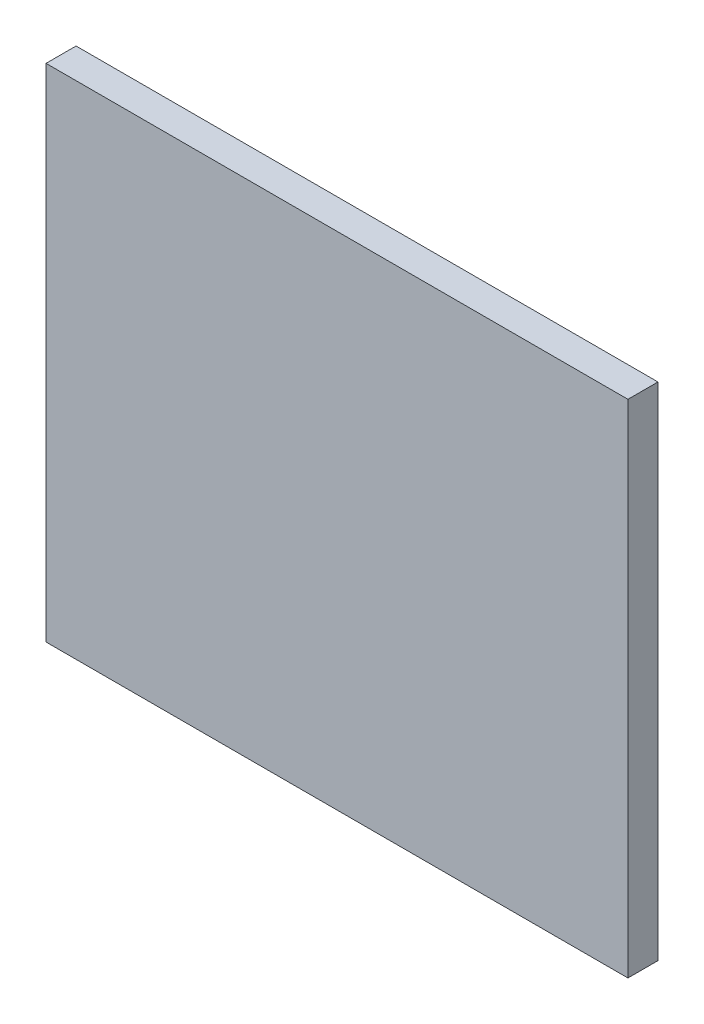
ISO-10303-21;
HEADER;
FILE_DESCRIPTION(('STEP AP214'),'2;1');
FILE_NAME('part.step','',(''),(''),'','','');
FILE_SCHEMA(('AUTOMOTIVE_DESIGN { 1 0 10303 214 1 1 1 1 }'));
ENDSEC;
DATA;
#1=APPLICATION_CONTEXT('core data for automotive mechanical design processes');
#2=APPLICATION_PROTOCOL_DEFINITION('international standard','automotive_design',2000,#1);
#3=PRODUCT_CONTEXT('',#1,'mechanical');
#4=PRODUCT('Part','Part','',(#3));
#5=PRODUCT_RELATED_PRODUCT_CATEGORY('part','',(#4));
#6=PRODUCT_DEFINITION_FORMATION('','',#4);
#7=PRODUCT_DEFINITION_CONTEXT('part definition',#1,'design');
#8=PRODUCT_DEFINITION('design','',#6,#7);
#9=PRODUCT_DEFINITION_SHAPE('','',#8);
#10=(LENGTH_UNIT() NAMED_UNIT(*) SI_UNIT(.MILLI.,.METRE.));
#11=(NAMED_UNIT(*) PLANE_ANGLE_UNIT() SI_UNIT($,.RADIAN.));
#12=(NAMED_UNIT(*) SI_UNIT($,.STERADIAN.) SOLID_ANGLE_UNIT());
#13=UNCERTAINTY_MEASURE_WITH_UNIT(LENGTH_MEASURE(1.E-05),#10,'distance_accuracy_value','');
#14=(GEOMETRIC_REPRESENTATION_CONTEXT(3) GLOBAL_UNCERTAINTY_ASSIGNED_CONTEXT((#13)) GLOBAL_UNIT_ASSIGNED_CONTEXT((#10,
#11,#12)) REPRESENTATION_CONTEXT('',''));
#15=CARTESIAN_POINT('',(0.,0.,0.));
#16=DIRECTION('',(0.,0.,1.));
#17=DIRECTION('',(1.,0.,0.));
#18=AXIS2_PLACEMENT_3D('',#15,#16,#17);
#19=CARTESIAN_POINT('',(15.5,13.35,1.6));
#20=DIRECTION('',(-1.,0.,0.));
#21=DIRECTION('',(0.,-1.,0.));
#22=AXIS2_PLACEMENT_3D('',#19,#20,#21);
#23=PLANE('',#22);
#24=DIRECTION('',(0.,1.,0.));
#25=VECTOR('',#24,1.);
#26=CARTESIAN_POINT('',(15.5,13.35,0.));
#27=LINE('',#26,#25);
#28=CARTESIAN_POINT('',(15.5,-13.35,0.));
#29=VERTEX_POINT('',#28);
#30=CARTESIAN_POINT('',(15.5,13.35,0.));
#31=VERTEX_POINT('',#30);
#32=EDGE_CURVE('E100',#29,#31,#27,.T.);
#33=ORIENTED_EDGE('',*,*,#32,.T.);
#34=DIRECTION('',(0.,0.,-1.));
#35=VECTOR('',#34,1.);
#36=CARTESIAN_POINT('',(15.5,13.35,1.6));
#37=LINE('',#36,#35);
#38=CARTESIAN_POINT('',(15.5,13.35,1.6));
#39=VERTEX_POINT('',#38);
#40=EDGE_CURVE('E11',#39,#31,#37,.T.);
#41=ORIENTED_EDGE('',*,*,#40,.F.);
#42=DIRECTION('',(0.,1.,0.));
#43=VECTOR('',#42,1.);
#44=CARTESIAN_POINT('',(15.5,13.35,1.6));
#45=LINE('',#44,#43);
#46=CARTESIAN_POINT('',(15.5,-13.35,1.6));
#47=VERTEX_POINT('',#46);
#48=EDGE_CURVE('E88',#47,#39,#45,.T.);
#49=ORIENTED_EDGE('',*,*,#48,.F.);
#50=DIRECTION('',(0.,0.,-1.));
#51=VECTOR('',#50,1.);
#52=CARTESIAN_POINT('',(15.5,-13.35,1.6));
#53=LINE('',#52,#51);
#54=EDGE_CURVE('E96',#47,#29,#53,.T.);
#55=ORIENTED_EDGE('',*,*,#54,.T.);
#56=EDGE_LOOP('',(#33,#41,#49,#55));
#57=FACE_BOUND('',#56,.T.);
#58=ADVANCED_FACE('F37',(#57),#23,.F.);
#59=CARTESIAN_POINT('',(-15.5,13.35,1.6));
#60=DIRECTION('',(0.,-1.,0.));
#61=DIRECTION('',(0.,0.,-1.));
#62=AXIS2_PLACEMENT_3D('',#59,#60,#61);
#63=PLANE('',#62);
#64=DIRECTION('',(-1.,0.,0.));
#65=VECTOR('',#64,1.);
#66=CARTESIAN_POINT('',(-15.5,13.35,0.));
#67=LINE('',#66,#65);
#68=CARTESIAN_POINT('',(-15.5,13.35,0.));
#69=VERTEX_POINT('',#68);
#70=EDGE_CURVE('E92',#31,#69,#67,.T.);
#71=ORIENTED_EDGE('',*,*,#70,.T.);
#72=DIRECTION('',(0.,0.,-1.));
#73=VECTOR('',#72,1.);
#74=CARTESIAN_POINT('',(-15.5,13.35,1.6));
#75=LINE('',#74,#73);
#76=CARTESIAN_POINT('',(-15.5,13.35,1.6));
#77=VERTEX_POINT('',#76);
#78=EDGE_CURVE('E45',#77,#69,#75,.T.);
#79=ORIENTED_EDGE('',*,*,#78,.F.);
#80=DIRECTION('',(-1.,0.,0.));
#81=VECTOR('',#80,1.);
#82=CARTESIAN_POINT('',(-15.5,13.35,1.6));
#83=LINE('',#82,#81);
#84=EDGE_CURVE('E83',#39,#77,#83,.T.);
#85=ORIENTED_EDGE('',*,*,#84,.F.);
#86=ORIENTED_EDGE('',*,*,#40,.T.);
#87=EDGE_LOOP('',(#71,#79,#85,#86));
#88=FACE_BOUND('',#87,.T.);
#89=ADVANCED_FACE('F91',(#88),#63,.F.);
#90=CARTESIAN_POINT('',(-15.5,13.35,1.6));
#91=DIRECTION('',(1.,0.,0.));
#92=DIRECTION('',(0.,0.,-1.));
#93=AXIS2_PLACEMENT_3D('',#90,#91,#92);
#94=PLANE('',#93);
#95=DIRECTION('',(0.,-1.,0.));
#96=VECTOR('',#95,1.);
#97=CARTESIAN_POINT('',(-15.5,13.35,0.));
#98=LINE('',#97,#96);
#99=CARTESIAN_POINT('',(-15.5,-13.35,0.));
#100=VERTEX_POINT('',#99);
#101=EDGE_CURVE('E70',#69,#100,#98,.T.);
#102=ORIENTED_EDGE('',*,*,#101,.T.);
#103=DIRECTION('',(0.,0.,-1.));
#104=VECTOR('',#103,1.);
#105=CARTESIAN_POINT('',(-15.5,-13.35,1.6));
#106=LINE('',#105,#104);
#107=CARTESIAN_POINT('',(-15.5,-13.35,1.6));
#108=VERTEX_POINT('',#107);
#109=EDGE_CURVE('E93',#108,#100,#106,.T.);
#110=ORIENTED_EDGE('',*,*,#109,.F.);
#111=DIRECTION('',(0.,-1.,0.));
#112=VECTOR('',#111,1.);
#113=CARTESIAN_POINT('',(-15.5,13.35,1.6));
#114=LINE('',#113,#112);
#115=EDGE_CURVE('E86',#77,#108,#114,.T.);
#116=ORIENTED_EDGE('',*,*,#115,.F.);
#117=ORIENTED_EDGE('',*,*,#78,.T.);
#118=EDGE_LOOP('',(#102,#110,#116,#117));
#119=FACE_BOUND('',#118,.T.);
#120=ADVANCED_FACE('F94',(#119),#94,.F.);
#121=CARTESIAN_POINT('',(-15.5,-13.35,1.6));
#122=DIRECTION('',(0.,1.,0.));
#123=DIRECTION('',(0.,0.,1.));
#124=AXIS2_PLACEMENT_3D('',#121,#122,#123);
#125=PLANE('',#124);
#126=DIRECTION('',(1.,0.,0.));
#127=VECTOR('',#126,1.);
#128=CARTESIAN_POINT('',(-15.5,-13.35,0.));
#129=LINE('',#128,#127);
#130=EDGE_CURVE('E76',#100,#29,#129,.T.);
#131=ORIENTED_EDGE('',*,*,#130,.T.);
#132=ORIENTED_EDGE('',*,*,#54,.F.);
#133=DIRECTION('',(1.,0.,0.));
#134=VECTOR('',#133,1.);
#135=CARTESIAN_POINT('',(-15.5,-13.35,1.6));
#136=LINE('',#135,#134);
#137=EDGE_CURVE('E53',#108,#47,#136,.T.);
#138=ORIENTED_EDGE('',*,*,#137,.F.);
#139=ORIENTED_EDGE('',*,*,#109,.T.);
#140=EDGE_LOOP('',(#131,#132,#138,#139));
#141=FACE_BOUND('',#140,.T.);
#142=ADVANCED_FACE('F107',(#141),#125,.F.);
#143=CARTESIAN_POINT('',(0.,0.,1.6));
#144=DIRECTION('',(0.,0.,1.));
#145=DIRECTION('',(1.,0.,0.));
#146=AXIS2_PLACEMENT_3D('',#143,#144,#145);
#147=PLANE('',#146);
#148=ORIENTED_EDGE('',*,*,#48,.T.);
#149=ORIENTED_EDGE('',*,*,#84,.T.);
#150=ORIENTED_EDGE('',*,*,#115,.T.);
#151=ORIENTED_EDGE('',*,*,#137,.T.);
#152=EDGE_LOOP('',(#148,#149,#150,#151));
#153=FACE_BOUND('',#152,.T.);
#154=ADVANCED_FACE('F84',(#153),#147,.T.);
#155=CARTESIAN_POINT('',(0.,0.,0.));
#156=DIRECTION('',(0.,0.,1.));
#157=DIRECTION('',(1.,0.,0.));
#158=AXIS2_PLACEMENT_3D('',#155,#156,#157);
#159=PLANE('',#158);
#160=ORIENTED_EDGE('',*,*,#32,.F.);
#161=ORIENTED_EDGE('',*,*,#130,.F.);
#162=ORIENTED_EDGE('',*,*,#101,.F.);
#163=ORIENTED_EDGE('',*,*,#70,.F.);
#164=EDGE_LOOP('',(#160,#161,#162,#163));
#165=FACE_BOUND('',#164,.T.);
#166=ADVANCED_FACE('F110',(#165),#159,.F.);
#167=CLOSED_SHELL('',(#58,#89,#120,#142,#154,#166));
#168=MANIFOLD_SOLID_BREP('B2',#167);
#169=ADVANCED_BREP_SHAPE_REPRESENTATION('',(#18,#168),#14);
#170=SHAPE_DEFINITION_REPRESENTATION(#9,#169);
ENDSEC;
END-ISO-10303-21;
